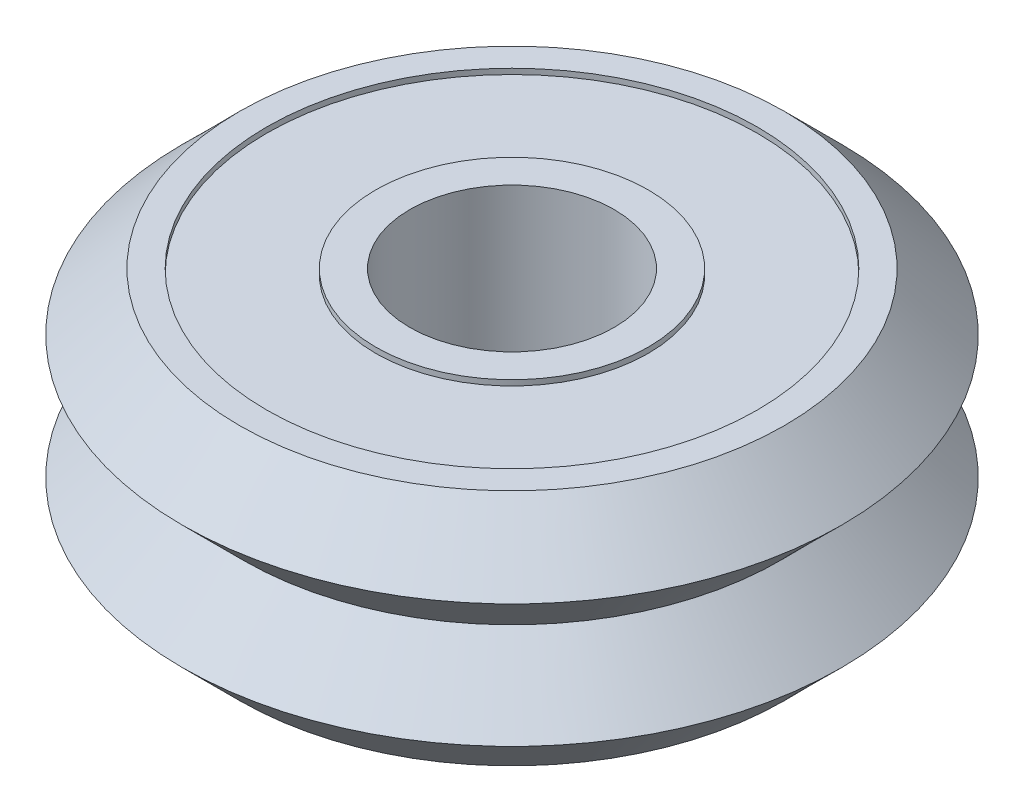
ISO-10303-21;
HEADER;
FILE_DESCRIPTION(('STEP AP214'),'2;1');
FILE_NAME('part.step','',(''),(''),'','','');
FILE_SCHEMA(('AUTOMOTIVE_DESIGN { 1 0 10303 214 1 1 1 1 }'));
ENDSEC;
DATA;
#1=APPLICATION_CONTEXT('core data for automotive mechanical design processes');
#2=APPLICATION_PROTOCOL_DEFINITION('international standard','automotive_design',2000,#1);
#3=PRODUCT_CONTEXT('',#1,'mechanical');
#4=PRODUCT('Part','Part','',(#3));
#5=PRODUCT_RELATED_PRODUCT_CATEGORY('part','',(#4));
#6=PRODUCT_DEFINITION_FORMATION('','',#4);
#7=PRODUCT_DEFINITION_CONTEXT('part definition',#1,'design');
#8=PRODUCT_DEFINITION('design','',#6,#7);
#9=PRODUCT_DEFINITION_SHAPE('','',#8);
#10=(LENGTH_UNIT() NAMED_UNIT(*) SI_UNIT(.MILLI.,.METRE.));
#11=(NAMED_UNIT(*) PLANE_ANGLE_UNIT() SI_UNIT($,.RADIAN.));
#12=(NAMED_UNIT(*) SI_UNIT($,.STERADIAN.) SOLID_ANGLE_UNIT());
#13=UNCERTAINTY_MEASURE_WITH_UNIT(LENGTH_MEASURE(1.E-05),#10,'distance_accuracy_value','');
#14=(GEOMETRIC_REPRESENTATION_CONTEXT(3) GLOBAL_UNCERTAINTY_ASSIGNED_CONTEXT((#13)) GLOBAL_UNIT_ASSIGNED_CONTEXT((#10,
#11,#12)) REPRESENTATION_CONTEXT('',''));
#15=CARTESIAN_POINT('',(0.,0.,0.));
#16=DIRECTION('',(0.,0.,1.));
#17=DIRECTION('',(1.,0.,0.));
#18=AXIS2_PLACEMENT_3D('',#15,#16,#17);
#19=CARTESIAN_POINT('',(-11.43,5.55,0.));
#20=DIRECTION('',(0.,1.,0.));
#21=DIRECTION('',(0.,0.,1.));
#22=AXIS2_PLACEMENT_3D('',#19,#20,#21);
#23=PLANE('',#22);
#24=CARTESIAN_POINT('',(0.,5.55,0.));
#25=DIRECTION('',(0.,1.,0.));
#26=DIRECTION('',(0.,0.,1.));
#27=AXIS2_PLACEMENT_3D('',#24,#25,#26);
#28=CIRCLE('',#27,12.69);
#29=CARTESIAN_POINT('',(0.,5.55,12.69));
#30=VERTEX_POINT('',#29);
#31=EDGE_CURVE('E82',#30,#30,#28,.T.);
#32=ORIENTED_EDGE('',*,*,#31,.T.);
#33=EDGE_LOOP('',(#32));
#34=FACE_BOUND('',#33,.T.);
#35=CARTESIAN_POINT('',(0.,5.55,0.));
#36=DIRECTION('',(0.,1.,0.));
#37=DIRECTION('',(0.,0.,1.));
#38=AXIS2_PLACEMENT_3D('',#35,#36,#37);
#39=CIRCLE('',#38,11.43);
#40=CARTESIAN_POINT('',(0.,5.55,11.43));
#41=VERTEX_POINT('',#40);
#42=EDGE_CURVE('E10',#41,#41,#39,.T.);
#43=ORIENTED_EDGE('',*,*,#42,.F.);
#44=EDGE_LOOP('',(#43));
#45=FACE_BOUND('',#44,.T.);
#46=ADVANCED_FACE('F33',(#34,#45),#23,.T.);
#47=CARTESIAN_POINT('',(0.,0.,0.));
#48=DIRECTION('',(0.,1.,0.));
#49=DIRECTION('',(0.,0.,1.));
#50=AXIS2_PLACEMENT_3D('',#47,#48,#49);
#51=CYLINDRICAL_SURFACE('',#50,11.43);
#52=ORIENTED_EDGE('',*,*,#42,.T.);
#53=EDGE_LOOP('',(#52));
#54=FACE_BOUND('',#53,.T.);
#55=CARTESIAN_POINT('',(0.,5.296,0.));
#56=DIRECTION('',(0.,1.,0.));
#57=DIRECTION('',(0.,0.,1.));
#58=AXIS2_PLACEMENT_3D('',#55,#56,#57);
#59=CIRCLE('',#58,11.43);
#60=CARTESIAN_POINT('',(0.,5.296,11.43));
#61=VERTEX_POINT('',#60);
#62=EDGE_CURVE('E39',#61,#61,#59,.T.);
#63=ORIENTED_EDGE('',*,*,#62,.F.);
#64=EDGE_LOOP('',(#63));
#65=FACE_BOUND('',#64,.T.);
#66=ADVANCED_FACE('F100',(#54,#65),#51,.F.);
#67=CARTESIAN_POINT('',(-6.35,5.296,0.));
#68=DIRECTION('',(0.,1.,0.));
#69=DIRECTION('',(0.,0.,1.));
#70=AXIS2_PLACEMENT_3D('',#67,#68,#69);
#71=PLANE('',#70);
#72=ORIENTED_EDGE('',*,*,#62,.T.);
#73=EDGE_LOOP('',(#72));
#74=FACE_BOUND('',#73,.T.);
#75=CARTESIAN_POINT('',(0.,5.296,0.));
#76=DIRECTION('',(0.,1.,0.));
#77=DIRECTION('',(0.,0.,1.));
#78=AXIS2_PLACEMENT_3D('',#75,#76,#77);
#79=CIRCLE('',#78,6.35);
#80=CARTESIAN_POINT('',(0.,5.296,6.35));
#81=VERTEX_POINT('',#80);
#82=EDGE_CURVE('E43',#81,#81,#79,.T.);
#83=ORIENTED_EDGE('',*,*,#82,.F.);
#84=EDGE_LOOP('',(#83));
#85=FACE_BOUND('',#84,.T.);
#86=ADVANCED_FACE('F104',(#74,#85),#71,.T.);
#87=CARTESIAN_POINT('',(0.,0.,0.));
#88=DIRECTION('',(0.,1.,0.));
#89=DIRECTION('',(0.,0.,1.));
#90=AXIS2_PLACEMENT_3D('',#87,#88,#89);
#91=CYLINDRICAL_SURFACE('',#90,6.35);
#92=ORIENTED_EDGE('',*,*,#82,.T.);
#93=EDGE_LOOP('',(#92));
#94=FACE_BOUND('',#93,.T.);
#95=CARTESIAN_POINT('',(0.,5.55,0.));
#96=DIRECTION('',(0.,1.,0.));
#97=DIRECTION('',(0.,0.,1.));
#98=AXIS2_PLACEMENT_3D('',#95,#96,#97);
#99=CIRCLE('',#98,6.35);
#100=CARTESIAN_POINT('',(0.,5.55,6.35));
#101=VERTEX_POINT('',#100);
#102=EDGE_CURVE('E47',#101,#101,#99,.T.);
#103=ORIENTED_EDGE('',*,*,#102,.F.);
#104=EDGE_LOOP('',(#103));
#105=FACE_BOUND('',#104,.T.);
#106=ADVANCED_FACE('F108',(#94,#105),#91,.T.);
#107=CARTESIAN_POINT('',(-4.7625,5.55,0.));
#108=DIRECTION('',(0.,1.,0.));
#109=DIRECTION('',(0.,0.,1.));
#110=AXIS2_PLACEMENT_3D('',#107,#108,#109);
#111=PLANE('',#110);
#112=ORIENTED_EDGE('',*,*,#102,.T.);
#113=EDGE_LOOP('',(#112));
#114=FACE_BOUND('',#113,.T.);
#115=CARTESIAN_POINT('',(0.,5.55,0.));
#116=DIRECTION('',(0.,1.,0.));
#117=DIRECTION('',(0.,0.,1.));
#118=AXIS2_PLACEMENT_3D('',#115,#116,#117);
#119=CIRCLE('',#118,4.7625);
#120=CARTESIAN_POINT('',(0.,5.55,4.7625));
#121=VERTEX_POINT('',#120);
#122=EDGE_CURVE('E52',#121,#121,#119,.T.);
#123=ORIENTED_EDGE('',*,*,#122,.F.);
#124=EDGE_LOOP('',(#123));
#125=FACE_BOUND('',#124,.T.);
#126=ADVANCED_FACE('F114',(#114,#125),#111,.T.);
#127=CARTESIAN_POINT('',(0.,0.,0.));
#128=DIRECTION('',(0.,1.,0.));
#129=DIRECTION('',(0.,0.,1.));
#130=AXIS2_PLACEMENT_3D('',#127,#128,#129);
#131=CYLINDRICAL_SURFACE('',#130,4.7625);
#132=ORIENTED_EDGE('',*,*,#122,.T.);
#133=EDGE_LOOP('',(#132));
#134=FACE_BOUND('',#133,.T.);
#135=CARTESIAN_POINT('',(0.,-5.55,0.));
#136=DIRECTION('',(0.,1.,0.));
#137=DIRECTION('',(0.,0.,1.));
#138=AXIS2_PLACEMENT_3D('',#135,#136,#137);
#139=CIRCLE('',#138,4.7625);
#140=CARTESIAN_POINT('',(0.,-5.55,4.7625));
#141=VERTEX_POINT('',#140);
#142=EDGE_CURVE('E55',#141,#141,#139,.T.);
#143=ORIENTED_EDGE('',*,*,#142,.F.);
#144=EDGE_LOOP('',(#143));
#145=FACE_BOUND('',#144,.T.);
#146=ADVANCED_FACE('F118',(#134,#145),#131,.F.);
#147=CARTESIAN_POINT('',(-6.35000000000008,-5.55,0.));
#148=DIRECTION('',(0.,-1.,0.));
#149=DIRECTION('',(0.,0.,-1.));
#150=AXIS2_PLACEMENT_3D('',#147,#148,#149);
#151=PLANE('',#150);
#152=ORIENTED_EDGE('',*,*,#142,.T.);
#153=EDGE_LOOP('',(#152));
#154=FACE_BOUND('',#153,.T.);
#155=CARTESIAN_POINT('',(0.,-5.55,0.));
#156=DIRECTION('',(0.,1.,0.));
#157=DIRECTION('',(0.,0.,1.));
#158=AXIS2_PLACEMENT_3D('',#155,#156,#157);
#159=CIRCLE('',#158,6.35000000000008);
#160=CARTESIAN_POINT('',(0.,-5.55,6.35000000000008));
#161=VERTEX_POINT('',#160);
#162=EDGE_CURVE('E58',#161,#161,#159,.T.);
#163=ORIENTED_EDGE('',*,*,#162,.F.);
#164=EDGE_LOOP('',(#163));
#165=FACE_BOUND('',#164,.T.);
#166=ADVANCED_FACE('F122',(#154,#165),#151,.T.);
#167=CARTESIAN_POINT('',(0.,0.,0.));
#168=DIRECTION('',(0.,1.,0.));
#169=DIRECTION('',(0.,0.,1.));
#170=AXIS2_PLACEMENT_3D('',#167,#168,#169);
#171=CYLINDRICAL_SURFACE('',#170,6.35000000000008);
#172=ORIENTED_EDGE('',*,*,#162,.T.);
#173=EDGE_LOOP('',(#172));
#174=FACE_BOUND('',#173,.T.);
#175=CARTESIAN_POINT('',(0.,-5.296,0.));
#176=DIRECTION('',(0.,1.,0.));
#177=DIRECTION('',(0.,0.,1.));
#178=AXIS2_PLACEMENT_3D('',#175,#176,#177);
#179=CIRCLE('',#178,6.35000000000008);
#180=CARTESIAN_POINT('',(0.,-5.296,6.35000000000008));
#181=VERTEX_POINT('',#180);
#182=EDGE_CURVE('E61',#181,#181,#179,.T.);
#183=ORIENTED_EDGE('',*,*,#182,.F.);
#184=EDGE_LOOP('',(#183));
#185=FACE_BOUND('',#184,.T.);
#186=ADVANCED_FACE('F126',(#174,#185),#171,.T.);
#187=CARTESIAN_POINT('',(-11.43,-5.296,0.));
#188=DIRECTION('',(0.,-1.,0.));
#189=DIRECTION('',(0.,0.,-1.));
#190=AXIS2_PLACEMENT_3D('',#187,#188,#189);
#191=PLANE('',#190);
#192=ORIENTED_EDGE('',*,*,#182,.T.);
#193=EDGE_LOOP('',(#192));
#194=FACE_BOUND('',#193,.T.);
#195=CARTESIAN_POINT('',(0.,-5.296,0.));
#196=DIRECTION('',(0.,1.,0.));
#197=DIRECTION('',(0.,0.,1.));
#198=AXIS2_PLACEMENT_3D('',#195,#196,#197);
#199=CIRCLE('',#198,11.43);
#200=CARTESIAN_POINT('',(0.,-5.296,11.43));
#201=VERTEX_POINT('',#200);
#202=EDGE_CURVE('E64',#201,#201,#199,.T.);
#203=ORIENTED_EDGE('',*,*,#202,.F.);
#204=EDGE_LOOP('',(#203));
#205=FACE_BOUND('',#204,.T.);
#206=ADVANCED_FACE('F130',(#194,#205),#191,.T.);
#207=CARTESIAN_POINT('',(0.,0.,0.));
#208=DIRECTION('',(0.,1.,0.));
#209=DIRECTION('',(0.,0.,1.));
#210=AXIS2_PLACEMENT_3D('',#207,#208,#209);
#211=CYLINDRICAL_SURFACE('',#210,11.43);
#212=ORIENTED_EDGE('',*,*,#202,.T.);
#213=EDGE_LOOP('',(#212));
#214=FACE_BOUND('',#213,.T.);
#215=CARTESIAN_POINT('',(0.,-5.55,0.));
#216=DIRECTION('',(0.,1.,0.));
#217=DIRECTION('',(0.,0.,1.));
#218=AXIS2_PLACEMENT_3D('',#215,#216,#217);
#219=CIRCLE('',#218,11.43);
#220=CARTESIAN_POINT('',(0.,-5.55,11.43));
#221=VERTEX_POINT('',#220);
#222=EDGE_CURVE('E67',#221,#221,#219,.T.);
#223=ORIENTED_EDGE('',*,*,#222,.F.);
#224=EDGE_LOOP('',(#223));
#225=FACE_BOUND('',#224,.T.);
#226=ADVANCED_FACE('F134',(#214,#225),#211,.F.);
#227=CARTESIAN_POINT('',(-12.69,-5.55,0.));
#228=DIRECTION('',(0.,-1.,0.));
#229=DIRECTION('',(0.,0.,-1.));
#230=AXIS2_PLACEMENT_3D('',#227,#228,#229);
#231=PLANE('',#230);
#232=ORIENTED_EDGE('',*,*,#222,.T.);
#233=EDGE_LOOP('',(#232));
#234=FACE_BOUND('',#233,.T.);
#235=CARTESIAN_POINT('',(0.,-5.55,0.));
#236=DIRECTION('',(0.,1.,0.));
#237=DIRECTION('',(0.,0.,1.));
#238=AXIS2_PLACEMENT_3D('',#235,#236,#237);
#239=CIRCLE('',#238,12.69);
#240=CARTESIAN_POINT('',(0.,-5.55,12.69));
#241=VERTEX_POINT('',#240);
#242=EDGE_CURVE('E70',#241,#241,#239,.T.);
#243=ORIENTED_EDGE('',*,*,#242,.F.);
#244=EDGE_LOOP('',(#243));
#245=FACE_BOUND('',#244,.T.);
#246=ADVANCED_FACE('F138',(#234,#245),#231,.T.);
#247=CARTESIAN_POINT('',(0.,-2.87500000000001,0.));
#248=DIRECTION('',(0.,1.,0.));
#249=DIRECTION('',(0.,0.,1.));
#250=AXIS2_PLACEMENT_3D('',#247,#248,#249);
#251=CONICAL_SURFACE('',#250,15.365,0.785398163397449);
#252=ORIENTED_EDGE('',*,*,#242,.T.);
#253=EDGE_LOOP('',(#252));
#254=FACE_BOUND('',#253,.T.);
#255=CARTESIAN_POINT('',(0.,-2.87500000000001,0.));
#256=DIRECTION('',(0.,1.,0.));
#257=DIRECTION('',(0.,0.,1.));
#258=AXIS2_PLACEMENT_3D('',#255,#256,#257);
#259=CIRCLE('',#258,15.365);
#260=CARTESIAN_POINT('',(0.,-2.87500000000001,15.365));
#261=VERTEX_POINT('',#260);
#262=EDGE_CURVE('E73',#261,#261,#259,.T.);
#263=ORIENTED_EDGE('',*,*,#262,.F.);
#264=EDGE_LOOP('',(#263));
#265=FACE_BOUND('',#264,.T.);
#266=ADVANCED_FACE('F142',(#254,#265),#251,.T.);
#267=CARTESIAN_POINT('',(0.,0.,0.));
#268=DIRECTION('',(0.,-1.,0.));
#269=DIRECTION('',(0.,0.,-1.));
#270=AXIS2_PLACEMENT_3D('',#267,#268,#269);
#271=CONICAL_SURFACE('',#270,12.49,0.785398163397447);
#272=ORIENTED_EDGE('',*,*,#262,.T.);
#273=EDGE_LOOP('',(#272));
#274=FACE_BOUND('',#273,.T.);
#275=CARTESIAN_POINT('',(0.,0.,0.));
#276=DIRECTION('',(0.,1.,0.));
#277=DIRECTION('',(0.,0.,1.));
#278=AXIS2_PLACEMENT_3D('',#275,#276,#277);
#279=CIRCLE('',#278,12.49);
#280=CARTESIAN_POINT('',(0.,0.,12.49));
#281=VERTEX_POINT('',#280);
#282=EDGE_CURVE('E76',#281,#281,#279,.T.);
#283=ORIENTED_EDGE('',*,*,#282,.F.);
#284=EDGE_LOOP('',(#283));
#285=FACE_BOUND('',#284,.T.);
#286=ADVANCED_FACE('F96',(#274,#285),#271,.T.);
#287=CARTESIAN_POINT('',(0.,2.875,0.));
#288=DIRECTION('',(0.,1.,0.));
#289=DIRECTION('',(0.,0.,1.));
#290=AXIS2_PLACEMENT_3D('',#287,#288,#289);
#291=CONICAL_SURFACE('',#290,15.365,0.785398163397447);
#292=ORIENTED_EDGE('',*,*,#282,.T.);
#293=EDGE_LOOP('',(#292));
#294=FACE_BOUND('',#293,.T.);
#295=CARTESIAN_POINT('',(0.,2.875,0.));
#296=DIRECTION('',(0.,1.,0.));
#297=DIRECTION('',(0.,0.,1.));
#298=AXIS2_PLACEMENT_3D('',#295,#296,#297);
#299=CIRCLE('',#298,15.365);
#300=CARTESIAN_POINT('',(0.,2.875,15.365));
#301=VERTEX_POINT('',#300);
#302=EDGE_CURVE('E79',#301,#301,#299,.T.);
#303=ORIENTED_EDGE('',*,*,#302,.F.);
#304=EDGE_LOOP('',(#303));
#305=FACE_BOUND('',#304,.T.);
#306=ADVANCED_FACE('F90',(#294,#305),#291,.T.);
#307=CARTESIAN_POINT('',(0.,5.55,0.));
#308=DIRECTION('',(0.,-1.,0.));
#309=DIRECTION('',(0.,0.,-1.));
#310=AXIS2_PLACEMENT_3D('',#307,#308,#309);
#311=CONICAL_SURFACE('',#310,12.69,0.785398163397449);
#312=ORIENTED_EDGE('',*,*,#302,.T.);
#313=EDGE_LOOP('',(#312));
#314=FACE_BOUND('',#313,.T.);
#315=ORIENTED_EDGE('',*,*,#31,.F.);
#316=EDGE_LOOP('',(#315));
#317=FACE_BOUND('',#316,.T.);
#318=ADVANCED_FACE('F88',(#314,#317),#311,.T.);
#319=CLOSED_SHELL('',(#46,#66,#86,#106,#126,#146,#166,#186,#206,#226,#246,#266,#286,#306,#318));
#320=MANIFOLD_SOLID_BREP('B2',#319);
#321=ADVANCED_BREP_SHAPE_REPRESENTATION('',(#18,#320),#14);
#322=SHAPE_DEFINITION_REPRESENTATION(#9,#321);
ENDSEC;
END-ISO-10303-21;
